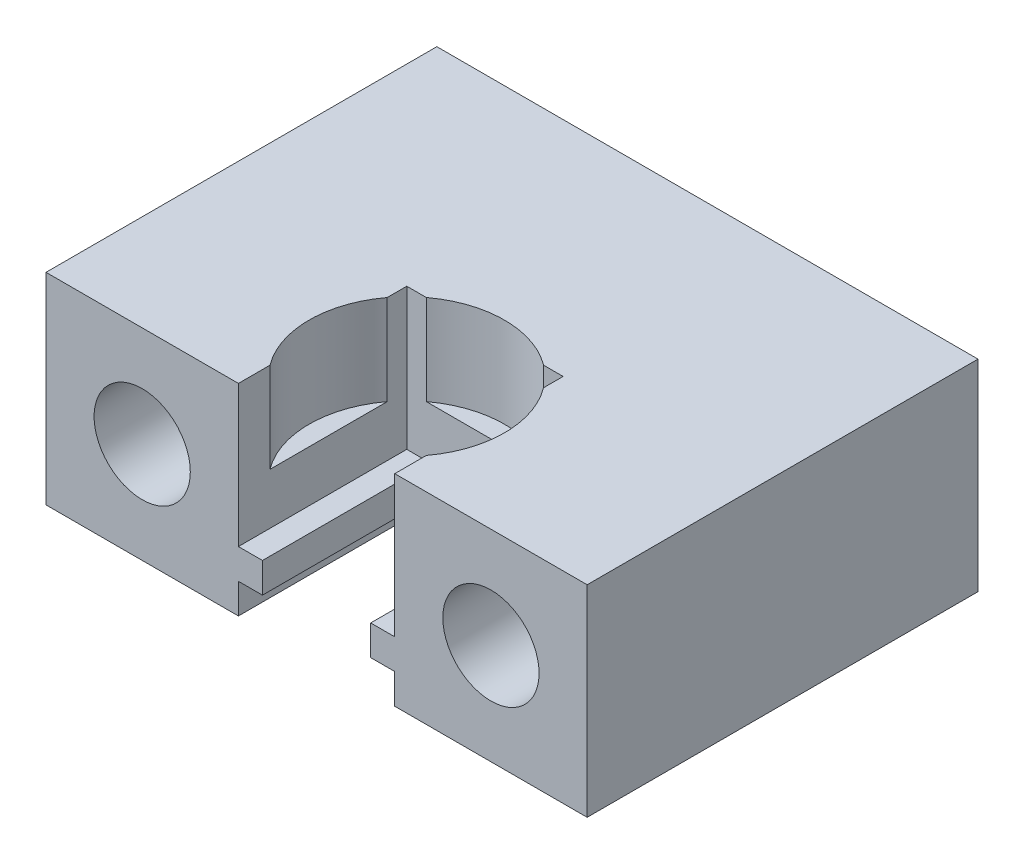
ISO-10303-21;
HEADER;
FILE_DESCRIPTION(('STEP AP214'),'2;1');
FILE_NAME('part.step','',(''),(''),'','','');
FILE_SCHEMA(('AUTOMOTIVE_DESIGN { 1 0 10303 214 1 1 1 1 }'));
ENDSEC;
DATA;
#1=APPLICATION_CONTEXT('core data for automotive mechanical design processes');
#2=APPLICATION_PROTOCOL_DEFINITION('international standard','automotive_design',2000,#1);
#3=PRODUCT_CONTEXT('',#1,'mechanical');
#4=PRODUCT('Part','Part','',(#3));
#5=PRODUCT_RELATED_PRODUCT_CATEGORY('part','',(#4));
#6=PRODUCT_DEFINITION_FORMATION('','',#4);
#7=PRODUCT_DEFINITION_CONTEXT('part definition',#1,'design');
#8=PRODUCT_DEFINITION('design','',#6,#7);
#9=PRODUCT_DEFINITION_SHAPE('','',#8);
#10=(LENGTH_UNIT() NAMED_UNIT(*) SI_UNIT(.MILLI.,.METRE.));
#11=(NAMED_UNIT(*) PLANE_ANGLE_UNIT() SI_UNIT($,.RADIAN.));
#12=(NAMED_UNIT(*) SI_UNIT($,.STERADIAN.) SOLID_ANGLE_UNIT());
#13=UNCERTAINTY_MEASURE_WITH_UNIT(LENGTH_MEASURE(1.E-05),#10,'distance_accuracy_value','');
#14=(GEOMETRIC_REPRESENTATION_CONTEXT(3) GLOBAL_UNCERTAINTY_ASSIGNED_CONTEXT((#13)) GLOBAL_UNIT_ASSIGNED_CONTEXT((#10,
#11,#12)) REPRESENTATION_CONTEXT('',''));
#15=CARTESIAN_POINT('',(0.,0.,0.));
#16=DIRECTION('',(0.,0.,1.));
#17=DIRECTION('',(1.,0.,0.));
#18=AXIS2_PLACEMENT_3D('',#15,#16,#17);
#19=CARTESIAN_POINT('',(2.6,6.7010000000001,7.39999999999997));
#20=DIRECTION('',(1.,0.,0.));
#21=DIRECTION('',(0.,0.,-1.));
#22=AXIS2_PLACEMENT_3D('',#19,#20,#21);
#23=PLANE('',#22);
#24=DIRECTION('',(0.,-1.,0.));
#25=VECTOR('',#24,1.);
#26=CARTESIAN_POINT('',(2.6,6.7010000000001,7.39999999999997));
#27=LINE('',#26,#25);
#28=CARTESIAN_POINT('',(2.6,6.70000000000005,7.39999999999997));
#29=VERTEX_POINT('',#28);
#30=CARTESIAN_POINT('',(2.6,2.,7.39999999999997));
#31=VERTEX_POINT('',#30);
#32=EDGE_CURVE('E281',#29,#31,#27,.T.);
#33=ORIENTED_EDGE('',*,*,#32,.T.);
#34=DIRECTION('',(0.,0.,1.));
#35=VECTOR('',#34,1.);
#36=CARTESIAN_POINT('',(2.6,2.,6.1193751525134));
#37=LINE('',#36,#35);
#38=CARTESIAN_POINT('',(2.6,2.,13.));
#39=VERTEX_POINT('',#38);
#40=EDGE_CURVE('E192',#31,#39,#37,.T.);
#41=ORIENTED_EDGE('',*,*,#40,.T.);
#42=DIRECTION('',(0.,-1.,0.));
#43=VECTOR('',#42,1.);
#44=CARTESIAN_POINT('',(2.6,6.7010000000001,13.));
#45=LINE('',#44,#43);
#46=CARTESIAN_POINT('',(2.6,6.70000000000003,13.));
#47=VERTEX_POINT('',#46);
#48=EDGE_CURVE('E293',#47,#39,#45,.T.);
#49=ORIENTED_EDGE('',*,*,#48,.F.);
#50=DIRECTION('',(0.,0.,-1.));
#51=VECTOR('',#50,1.);
#52=CARTESIAN_POINT('',(2.6,6.70000000000003,7.39999999999997));
#53=LINE('',#52,#51);
#54=CARTESIAN_POINT('',(2.6,6.70000000000005,11.95));
#55=VERTEX_POINT('',#54);
#56=EDGE_CURVE('E268',#47,#55,#53,.T.);
#57=ORIENTED_EDGE('',*,*,#56,.T.);
#58=DIRECTION('',(0.,1.,0.));
#59=VECTOR('',#58,1.);
#60=CARTESIAN_POINT('',(2.6,3.70000000000005,11.95));
#61=LINE('',#60,#59);
#62=CARTESIAN_POINT('',(2.6,3.70000000000005,11.95));
#63=VERTEX_POINT('',#62);
#64=EDGE_CURVE('E253',#55,#63,#61,.F.);
#65=ORIENTED_EDGE('',*,*,#64,.T.);
#66=DIRECTION('',(0.,0.,1.));
#67=VECTOR('',#66,1.);
#68=CARTESIAN_POINT('',(2.6,3.70000000000005,7.39999999999997));
#69=LINE('',#68,#67);
#70=CARTESIAN_POINT('',(2.6,3.70000000000005,8.04999999999991));
#71=VERTEX_POINT('',#70);
#72=EDGE_CURVE('E245',#71,#63,#69,.T.);
#73=ORIENTED_EDGE('',*,*,#72,.F.);
#74=DIRECTION('',(0.,1.,0.));
#75=VECTOR('',#74,1.);
#76=CARTESIAN_POINT('',(2.6,3.70000000000005,8.04999999999991));
#77=LINE('',#76,#75);
#78=CARTESIAN_POINT('',(2.6,6.70000000000005,8.04999999999991));
#79=VERTEX_POINT('',#78);
#80=EDGE_CURVE('E256',#71,#79,#77,.T.);
#81=ORIENTED_EDGE('',*,*,#80,.T.);
#82=EDGE_CURVE('E267',#79,#29,#53,.T.);
#83=ORIENTED_EDGE('',*,*,#82,.T.);
#84=EDGE_LOOP('',(#33,#41,#49,#57,#65,#73,#81,#83));
#85=FACE_BOUND('',#84,.T.);
#86=ADVANCED_FACE('F33',(#85),#23,.F.);
#87=CARTESIAN_POINT('',(-2.6,6.7010000000001,7.39999999999997));
#88=DIRECTION('',(-1.,0.,0.));
#89=DIRECTION('',(0.,0.,1.));
#90=AXIS2_PLACEMENT_3D('',#87,#88,#89);
#91=PLANE('',#90);
#92=DIRECTION('',(0.,-1.,0.));
#93=VECTOR('',#92,1.);
#94=CARTESIAN_POINT('',(-2.6,6.7010000000001,7.39999999999997));
#95=LINE('',#94,#93);
#96=CARTESIAN_POINT('',(-2.6,1.,7.39999999999997));
#97=VERTEX_POINT('',#96);
#98=CARTESIAN_POINT('',(-2.6,0.,7.39999999999997));
#99=VERTEX_POINT('',#98);
#100=EDGE_CURVE('E288',#97,#99,#95,.T.);
#101=ORIENTED_EDGE('',*,*,#100,.F.);
#102=DIRECTION('',(0.,0.,1.));
#103=VECTOR('',#102,1.);
#104=CARTESIAN_POINT('',(-2.6,1.,6.1193751525134));
#105=LINE('',#104,#103);
#106=CARTESIAN_POINT('',(-2.6,1.,13.));
#107=VERTEX_POINT('',#106);
#108=EDGE_CURVE('E230',#97,#107,#105,.T.);
#109=ORIENTED_EDGE('',*,*,#108,.T.);
#110=DIRECTION('',(0.,-1.,0.));
#111=VECTOR('',#110,1.);
#112=CARTESIAN_POINT('',(-2.6,6.7010000000001,13.));
#113=LINE('',#112,#111);
#114=CARTESIAN_POINT('',(-2.6,0.,13.));
#115=VERTEX_POINT('',#114);
#116=EDGE_CURVE('E292',#107,#115,#113,.T.);
#117=ORIENTED_EDGE('',*,*,#116,.T.);
#118=DIRECTION('',(0.,0.,-1.));
#119=VECTOR('',#118,1.);
#120=CARTESIAN_POINT('',(-2.6,0.,7.39999999999997));
#121=LINE('',#120,#119);
#122=EDGE_CURVE('E271',#115,#99,#121,.T.);
#123=ORIENTED_EDGE('',*,*,#122,.T.);
#124=EDGE_LOOP('',(#101,#109,#117,#123));
#125=FACE_BOUND('',#124,.T.);
#126=ADVANCED_FACE('F376',(#125),#91,.F.);
#127=CARTESIAN_POINT('',(0.,0.,13.));
#128=DIRECTION('',(0.,0.,1.));
#129=DIRECTION('',(1.,0.,0.));
#130=AXIS2_PLACEMENT_3D('',#127,#128,#129);
#131=PLANE('',#130);
#132=CARTESIAN_POINT('',(5.8,3.35,13.));
#133=DIRECTION('',(0.,0.,-1.));
#134=DIRECTION('',(-1.,0.,0.));
#135=AXIS2_PLACEMENT_3D('',#132,#133,#134);
#136=CIRCLE('',#135,1.6);
#137=CARTESIAN_POINT('',(4.2,3.35,13.));
#138=VERTEX_POINT('',#137);
#139=EDGE_CURVE('E432',#138,#138,#136,.T.);
#140=ORIENTED_EDGE('',*,*,#139,.T.);
#141=EDGE_LOOP('',(#140));
#142=FACE_BOUND('',#141,.T.);
#143=ORIENTED_EDGE('',*,*,#48,.T.);
#144=DIRECTION('',(-1.,0.,0.));
#145=VECTOR('',#144,1.);
#146=CARTESIAN_POINT('',(2.6,2.,13.));
#147=LINE('',#146,#145);
#148=CARTESIAN_POINT('',(1.8,2.,13.));
#149=VERTEX_POINT('',#148);
#150=EDGE_CURVE('E421',#39,#149,#147,.T.);
#151=ORIENTED_EDGE('',*,*,#150,.T.);
#152=DIRECTION('',(0.,-1.,0.));
#153=VECTOR('',#152,1.);
#154=CARTESIAN_POINT('',(1.8,1.,13.));
#155=LINE('',#154,#153);
#156=CARTESIAN_POINT('',(1.8,1.,13.));
#157=VERTEX_POINT('',#156);
#158=EDGE_CURVE('E184',#149,#157,#155,.T.);
#159=ORIENTED_EDGE('',*,*,#158,.T.);
#160=DIRECTION('',(1.,0.,0.));
#161=VECTOR('',#160,1.);
#162=CARTESIAN_POINT('',(2.6,1.,13.));
#163=LINE('',#162,#161);
#164=CARTESIAN_POINT('',(2.6,1.,13.));
#165=VERTEX_POINT('',#164);
#166=EDGE_CURVE('E196',#157,#165,#163,.T.);
#167=ORIENTED_EDGE('',*,*,#166,.T.);
#168=CARTESIAN_POINT('',(2.6,0.,13.));
#169=VERTEX_POINT('',#168);
#170=EDGE_CURVE('E280',#165,#169,#45,.T.);
#171=ORIENTED_EDGE('',*,*,#170,.T.);
#172=DIRECTION('',(1.,0.,0.));
#173=VECTOR('',#172,1.);
#174=CARTESIAN_POINT('',(-8.99999999999999,0.,13.));
#175=LINE('',#174,#173);
#176=CARTESIAN_POINT('',(8.99999999999999,0.,13.));
#177=VERTEX_POINT('',#176);
#178=EDGE_CURVE('E299',#169,#177,#175,.T.);
#179=ORIENTED_EDGE('',*,*,#178,.T.);
#180=DIRECTION('',(0.,1.,0.));
#181=VECTOR('',#180,1.);
#182=CARTESIAN_POINT('',(8.99999999999999,6.69999999999999,13.));
#183=LINE('',#182,#181);
#184=CARTESIAN_POINT('',(8.99999999999999,6.69999999999999,13.));
#185=VERTEX_POINT('',#184);
#186=EDGE_CURVE('E304',#177,#185,#183,.T.);
#187=ORIENTED_EDGE('',*,*,#186,.T.);
#188=DIRECTION('',(-1.,0.,0.));
#189=VECTOR('',#188,1.);
#190=CARTESIAN_POINT('',(-8.99999999999999,6.7000000000001,13.));
#191=LINE('',#190,#189);
#192=EDGE_CURVE('E307',#185,#47,#191,.T.);
#193=ORIENTED_EDGE('',*,*,#192,.T.);
#194=EDGE_LOOP('',(#143,#151,#159,#167,#171,#179,#187,#193));
#195=FACE_BOUND('',#194,.T.);
#196=ADVANCED_FACE('F400',(#142,#195),#131,.T.);
#197=CARTESIAN_POINT('',(-8.99999999999999,6.7000000000001,13.));
#198=DIRECTION('',(1.,0.,0.));
#199=DIRECTION('',(0.,0.,-1.));
#200=AXIS2_PLACEMENT_3D('',#197,#198,#199);
#201=PLANE('',#200);
#202=DIRECTION('',(0.,-1.,0.));
#203=VECTOR('',#202,1.);
#204=CARTESIAN_POINT('',(-8.99999999999999,6.7000000000001,0.));
#205=LINE('',#204,#203);
#206=CARTESIAN_POINT('',(-8.99999999999999,6.7000000000001,0.));
#207=VERTEX_POINT('',#206);
#208=CARTESIAN_POINT('',(-8.99999999999999,0.,0.));
#209=VERTEX_POINT('',#208);
#210=EDGE_CURVE('E283',#207,#209,#205,.T.);
#211=ORIENTED_EDGE('',*,*,#210,.T.);
#212=DIRECTION('',(0.,0.,-1.));
#213=VECTOR('',#212,1.);
#214=CARTESIAN_POINT('',(-8.99999999999999,0.,13.));
#215=LINE('',#214,#213);
#216=CARTESIAN_POINT('',(-8.99999999999999,0.,13.));
#217=VERTEX_POINT('',#216);
#218=EDGE_CURVE('E326',#217,#209,#215,.T.);
#219=ORIENTED_EDGE('',*,*,#218,.F.);
#220=DIRECTION('',(0.,-1.,0.));
#221=VECTOR('',#220,1.);
#222=CARTESIAN_POINT('',(-8.99999999999999,6.7000000000001,13.));
#223=LINE('',#222,#221);
#224=CARTESIAN_POINT('',(-8.99999999999999,6.7000000000001,13.));
#225=VERTEX_POINT('',#224);
#226=EDGE_CURVE('E296',#225,#217,#223,.T.);
#227=ORIENTED_EDGE('',*,*,#226,.F.);
#228=DIRECTION('',(0.,0.,-1.));
#229=VECTOR('',#228,1.);
#230=CARTESIAN_POINT('',(-8.99999999999999,6.7000000000001,13.));
#231=LINE('',#230,#229);
#232=EDGE_CURVE('E310',#225,#207,#231,.T.);
#233=ORIENTED_EDGE('',*,*,#232,.T.);
#234=EDGE_LOOP('',(#211,#219,#227,#233));
#235=FACE_BOUND('',#234,.T.);
#236=ADVANCED_FACE('F35',(#235),#201,.F.);
#237=CARTESIAN_POINT('',(-8.99999999999999,0.,13.));
#238=DIRECTION('',(0.,1.,0.));
#239=DIRECTION('',(0.,0.,1.));
#240=AXIS2_PLACEMENT_3D('',#237,#238,#239);
#241=PLANE('',#240);
#242=ORIENTED_EDGE('',*,*,#178,.F.);
#243=DIRECTION('',(0.,0.,1.));
#244=VECTOR('',#243,1.);
#245=CARTESIAN_POINT('',(2.6,0.,7.39999999999997));
#246=LINE('',#245,#244);
#247=CARTESIAN_POINT('',(2.6,0.,7.39999999999997));
#248=VERTEX_POINT('',#247);
#249=EDGE_CURVE('E277',#248,#169,#246,.T.);
#250=ORIENTED_EDGE('',*,*,#249,.F.);
#251=DIRECTION('',(1.,0.,0.));
#252=VECTOR('',#251,1.);
#253=CARTESIAN_POINT('',(-2.6,0.,7.39999999999997));
#254=LINE('',#253,#252);
#255=EDGE_CURVE('E274',#99,#248,#254,.T.);
#256=ORIENTED_EDGE('',*,*,#255,.F.);
#257=ORIENTED_EDGE('',*,*,#122,.F.);
#258=EDGE_CURVE('E301',#217,#115,#175,.T.);
#259=ORIENTED_EDGE('',*,*,#258,.F.);
#260=ORIENTED_EDGE('',*,*,#218,.T.);
#261=DIRECTION('',(1.,0.,0.));
#262=VECTOR('',#261,1.);
#263=CARTESIAN_POINT('',(-8.99999999999999,0.,0.));
#264=LINE('',#263,#262);
#265=CARTESIAN_POINT('',(8.99999999999999,0.,0.));
#266=VERTEX_POINT('',#265);
#267=EDGE_CURVE('E313',#209,#266,#264,.T.);
#268=ORIENTED_EDGE('',*,*,#267,.T.);
#269=DIRECTION('',(0.,0.,-1.));
#270=VECTOR('',#269,1.);
#271=CARTESIAN_POINT('',(8.99999999999999,0.,13.));
#272=LINE('',#271,#270);
#273=EDGE_CURVE('E323',#177,#266,#272,.T.);
#274=ORIENTED_EDGE('',*,*,#273,.F.);
#275=EDGE_LOOP('',(#242,#250,#256,#257,#259,#260,#268,#274));
#276=FACE_BOUND('',#275,.T.);
#277=ADVANCED_FACE('F371',(#276),#241,.F.);
#278=CARTESIAN_POINT('',(8.99999999999999,6.69999999999999,13.));
#279=DIRECTION('',(-1.,0.,0.));
#280=DIRECTION('',(0.,-1.,0.));
#281=AXIS2_PLACEMENT_3D('',#278,#279,#280);
#282=PLANE('',#281);
#283=DIRECTION('',(0.,1.,0.));
#284=VECTOR('',#283,1.);
#285=CARTESIAN_POINT('',(8.99999999999999,6.69999999999999,0.));
#286=LINE('',#285,#284);
#287=CARTESIAN_POINT('',(8.99999999999999,6.69999999999999,0.));
#288=VERTEX_POINT('',#287);
#289=EDGE_CURVE('E315',#266,#288,#286,.T.);
#290=ORIENTED_EDGE('',*,*,#289,.T.);
#291=DIRECTION('',(0.,0.,-1.));
#292=VECTOR('',#291,1.);
#293=CARTESIAN_POINT('',(8.99999999999999,6.69999999999999,13.));
#294=LINE('',#293,#292);
#295=EDGE_CURVE('E320',#185,#288,#294,.T.);
#296=ORIENTED_EDGE('',*,*,#295,.F.);
#297=ORIENTED_EDGE('',*,*,#186,.F.);
#298=ORIENTED_EDGE('',*,*,#273,.T.);
#299=EDGE_LOOP('',(#290,#296,#297,#298));
#300=FACE_BOUND('',#299,.T.);
#301=ADVANCED_FACE('F507',(#300),#282,.F.);
#302=CARTESIAN_POINT('',(-8.99999999999999,6.7000000000001,13.));
#303=DIRECTION('',(0.,-1.,0.));
#304=DIRECTION('',(1.,0.,0.));
#305=AXIS2_PLACEMENT_3D('',#302,#303,#304);
#306=PLANE('',#305);
#307=DIRECTION('',(0.,0.,1.));
#308=VECTOR('',#307,1.);
#309=CARTESIAN_POINT('',(-2.6,6.70000000000006,7.39999999999997));
#310=LINE('',#309,#308);
#311=CARTESIAN_POINT('',(-2.6,6.70000000000005,11.9499999999999));
#312=VERTEX_POINT('',#311);
#313=CARTESIAN_POINT('',(-2.6,6.70000000000006,13.));
#314=VERTEX_POINT('',#313);
#315=EDGE_CURVE('E259',#312,#314,#310,.T.);
#316=ORIENTED_EDGE('',*,*,#315,.F.);
#317=CARTESIAN_POINT('',(0.,6.70000000000005,9.99999999999997));
#318=DIRECTION('',(0.,1.,0.));
#319=DIRECTION('',(0.,0.,1.));
#320=AXIS2_PLACEMENT_3D('',#317,#318,#319);
#321=CIRCLE('',#320,3.25);
#322=CARTESIAN_POINT('',(-2.6,6.70000000000005,8.05000000000002));
#323=VERTEX_POINT('',#322);
#324=EDGE_CURVE('E235',#323,#312,#321,.T.);
#325=ORIENTED_EDGE('',*,*,#324,.F.);
#326=CARTESIAN_POINT('',(-2.6,6.70000000000006,7.39999999999997));
#327=VERTEX_POINT('',#326);
#328=EDGE_CURVE('E260',#327,#323,#310,.T.);
#329=ORIENTED_EDGE('',*,*,#328,.F.);
#330=DIRECTION('',(-1.,0.,0.));
#331=VECTOR('',#330,1.);
#332=CARTESIAN_POINT('',(-2.6,6.70000000000006,7.39999999999997));
#333=LINE('',#332,#331);
#334=CARTESIAN_POINT('',(-1.94999999999996,6.70000000000005,7.39999999999997));
#335=VERTEX_POINT('',#334);
#336=EDGE_CURVE('E263',#335,#327,#333,.T.);
#337=ORIENTED_EDGE('',*,*,#336,.F.);
#338=CARTESIAN_POINT('',(1.95000000000004,6.70000000000005,7.39999999999997));
#339=VERTEX_POINT('',#338);
#340=EDGE_CURVE('E243',#339,#335,#321,.T.);
#341=ORIENTED_EDGE('',*,*,#340,.F.);
#342=EDGE_CURVE('E264',#29,#339,#333,.T.);
#343=ORIENTED_EDGE('',*,*,#342,.F.);
#344=ORIENTED_EDGE('',*,*,#82,.F.);
#345=EDGE_CURVE('E241',#55,#79,#321,.T.);
#346=ORIENTED_EDGE('',*,*,#345,.F.);
#347=ORIENTED_EDGE('',*,*,#56,.F.);
#348=ORIENTED_EDGE('',*,*,#192,.F.);
#349=ORIENTED_EDGE('',*,*,#295,.T.);
#350=DIRECTION('',(-1.,0.,0.));
#351=VECTOR('',#350,1.);
#352=CARTESIAN_POINT('',(-8.99999999999999,6.7000000000001,0.));
#353=LINE('',#352,#351);
#354=EDGE_CURVE('E300',#288,#207,#353,.T.);
#355=ORIENTED_EDGE('',*,*,#354,.T.);
#356=ORIENTED_EDGE('',*,*,#232,.F.);
#357=EDGE_CURVE('E306',#314,#225,#191,.T.);
#358=ORIENTED_EDGE('',*,*,#357,.F.);
#359=EDGE_LOOP('',(#316,#325,#329,#337,#341,#343,#344,#346,#347,#348,#349,#355,#356,#358));
#360=FACE_BOUND('',#359,.T.);
#361=ADVANCED_FACE('F343',(#360),#306,.F.);
#362=CARTESIAN_POINT('',(-5.8,3.35,13.));
#363=DIRECTION('',(0.,0.,1.));
#364=DIRECTION('',(1.,0.,0.));
#365=AXIS2_PLACEMENT_3D('',#362,#363,#364);
#366=CIRCLE('',#365,1.6);
#367=CARTESIAN_POINT('',(-4.2,3.35,13.));
#368=VERTEX_POINT('',#367);
#369=EDGE_CURVE('E428',#368,#368,#366,.T.);
#370=ORIENTED_EDGE('',*,*,#369,.F.);
#371=EDGE_LOOP('',(#370));
#372=FACE_BOUND('',#371,.T.);
#373=CARTESIAN_POINT('',(-2.6,2.,13.));
#374=VERTEX_POINT('',#373);
#375=EDGE_CURVE('E289',#314,#374,#113,.T.);
#376=ORIENTED_EDGE('',*,*,#375,.F.);
#377=ORIENTED_EDGE('',*,*,#357,.T.);
#378=ORIENTED_EDGE('',*,*,#226,.T.);
#379=ORIENTED_EDGE('',*,*,#258,.T.);
#380=ORIENTED_EDGE('',*,*,#116,.F.);
#381=DIRECTION('',(1.,0.,0.));
#382=VECTOR('',#381,1.);
#383=CARTESIAN_POINT('',(-2.6,1.,13.));
#384=LINE('',#383,#382);
#385=CARTESIAN_POINT('',(-1.8,1.,13.));
#386=VERTEX_POINT('',#385);
#387=EDGE_CURVE('E210',#107,#386,#384,.T.);
#388=ORIENTED_EDGE('',*,*,#387,.T.);
#389=DIRECTION('',(0.,1.,0.));
#390=VECTOR('',#389,1.);
#391=CARTESIAN_POINT('',(-1.8,1.,13.));
#392=LINE('',#391,#390);
#393=CARTESIAN_POINT('',(-1.8,2.,13.));
#394=VERTEX_POINT('',#393);
#395=EDGE_CURVE('E215',#386,#394,#392,.T.);
#396=ORIENTED_EDGE('',*,*,#395,.T.);
#397=DIRECTION('',(-1.,0.,0.));
#398=VECTOR('',#397,1.);
#399=CARTESIAN_POINT('',(-2.6,2.,13.));
#400=LINE('',#399,#398);
#401=EDGE_CURVE('E211',#394,#374,#400,.T.);
#402=ORIENTED_EDGE('',*,*,#401,.T.);
#403=EDGE_LOOP('',(#376,#377,#378,#379,#380,#388,#396,#402));
#404=FACE_BOUND('',#403,.T.);
#405=ADVANCED_FACE('F359',(#372,#404),#131,.T.);
#406=CARTESIAN_POINT('',(0.,0.,0.));
#407=DIRECTION('',(0.,0.,1.));
#408=DIRECTION('',(1.,0.,0.));
#409=AXIS2_PLACEMENT_3D('',#406,#407,#408);
#410=PLANE('',#409);
#411=CARTESIAN_POINT('',(5.8,3.35,0.));
#412=DIRECTION('',(0.,0.,1.));
#413=DIRECTION('',(1.,0.,0.));
#414=AXIS2_PLACEMENT_3D('',#411,#412,#413);
#415=CIRCLE('',#414,1.6);
#416=CARTESIAN_POINT('',(7.4,3.35,0.));
#417=VERTEX_POINT('',#416);
#418=EDGE_CURVE('E436',#417,#417,#415,.T.);
#419=ORIENTED_EDGE('',*,*,#418,.T.);
#420=EDGE_LOOP('',(#419));
#421=FACE_BOUND('',#420,.T.);
#422=CARTESIAN_POINT('',(-5.8,3.35,0.));
#423=DIRECTION('',(0.,0.,1.));
#424=DIRECTION('',(1.,0.,0.));
#425=AXIS2_PLACEMENT_3D('',#422,#423,#424);
#426=CIRCLE('',#425,1.6);
#427=CARTESIAN_POINT('',(-4.2,3.35,0.));
#428=VERTEX_POINT('',#427);
#429=EDGE_CURVE('E424',#428,#428,#426,.F.);
#430=ORIENTED_EDGE('',*,*,#429,.F.);
#431=EDGE_LOOP('',(#430));
#432=FACE_BOUND('',#431,.T.);
#433=ORIENTED_EDGE('',*,*,#210,.F.);
#434=ORIENTED_EDGE('',*,*,#354,.F.);
#435=ORIENTED_EDGE('',*,*,#289,.F.);
#436=ORIENTED_EDGE('',*,*,#267,.F.);
#437=EDGE_LOOP('',(#433,#434,#435,#436));
#438=FACE_BOUND('',#437,.T.);
#439=ADVANCED_FACE('F405',(#421,#432,#438),#410,.F.);
#440=ORIENTED_EDGE('',*,*,#170,.F.);
#441=DIRECTION('',(0.,0.,1.));
#442=VECTOR('',#441,1.);
#443=CARTESIAN_POINT('',(2.6,1.,6.1193751525134));
#444=LINE('',#443,#442);
#445=CARTESIAN_POINT('',(2.6,1.,7.39999999999997));
#446=VERTEX_POINT('',#445);
#447=EDGE_CURVE('E207',#446,#165,#444,.T.);
#448=ORIENTED_EDGE('',*,*,#447,.F.);
#449=EDGE_CURVE('E284',#446,#248,#27,.T.);
#450=ORIENTED_EDGE('',*,*,#449,.T.);
#451=ORIENTED_EDGE('',*,*,#249,.T.);
#452=EDGE_LOOP('',(#440,#448,#450,#451));
#453=FACE_BOUND('',#452,.T.);
#454=ADVANCED_FACE('F396',(#453),#23,.F.);
#455=CARTESIAN_POINT('',(-2.6,6.7010000000001,7.39999999999997));
#456=DIRECTION('',(0.,0.,-1.));
#457=DIRECTION('',(-1.,0.,0.));
#458=AXIS2_PLACEMENT_3D('',#455,#456,#457);
#459=PLANE('',#458);
#460=DIRECTION('',(0.,-1.,0.));
#461=VECTOR('',#460,1.);
#462=CARTESIAN_POINT('',(1.8,1.,7.39999999999997));
#463=LINE('',#462,#461);
#464=CARTESIAN_POINT('',(1.8,2.,7.39999999999997));
#465=VERTEX_POINT('',#464);
#466=CARTESIAN_POINT('',(1.8,1.,7.39999999999997));
#467=VERTEX_POINT('',#466);
#468=EDGE_CURVE('E48',#465,#467,#463,.T.);
#469=ORIENTED_EDGE('',*,*,#468,.F.);
#470=DIRECTION('',(-1.,0.,0.));
#471=VECTOR('',#470,1.);
#472=CARTESIAN_POINT('',(2.6,2.,7.39999999999997));
#473=LINE('',#472,#471);
#474=EDGE_CURVE('E187',#31,#465,#473,.T.);
#475=ORIENTED_EDGE('',*,*,#474,.F.);
#476=ORIENTED_EDGE('',*,*,#32,.F.);
#477=ORIENTED_EDGE('',*,*,#342,.T.);
#478=DIRECTION('',(0.,1.,0.));
#479=VECTOR('',#478,1.);
#480=CARTESIAN_POINT('',(1.95000000000005,3.70000000000005,7.39999999999997));
#481=LINE('',#480,#479);
#482=CARTESIAN_POINT('',(1.95000000000004,3.70000000000005,7.39999999999997));
#483=VERTEX_POINT('',#482);
#484=EDGE_CURVE('E247',#339,#483,#481,.F.);
#485=ORIENTED_EDGE('',*,*,#484,.T.);
#486=DIRECTION('',(1.,0.,0.));
#487=VECTOR('',#486,1.);
#488=CARTESIAN_POINT('',(-2.6,3.70000000000005,7.39999999999997));
#489=LINE('',#488,#487);
#490=CARTESIAN_POINT('',(-1.94999999999996,3.70000000000005,7.39999999999997));
#491=VERTEX_POINT('',#490);
#492=EDGE_CURVE('E238',#491,#483,#489,.T.);
#493=ORIENTED_EDGE('',*,*,#492,.F.);
#494=DIRECTION('',(0.,1.,0.));
#495=VECTOR('',#494,1.);
#496=CARTESIAN_POINT('',(-1.94999999999996,3.70000000000005,7.39999999999997));
#497=LINE('',#496,#495);
#498=EDGE_CURVE('E250',#491,#335,#497,.T.);
#499=ORIENTED_EDGE('',*,*,#498,.T.);
#500=ORIENTED_EDGE('',*,*,#336,.T.);
#501=CARTESIAN_POINT('',(-2.6,2.,7.39999999999997));
#502=VERTEX_POINT('',#501);
#503=EDGE_CURVE('E285',#327,#502,#95,.T.);
#504=ORIENTED_EDGE('',*,*,#503,.T.);
#505=DIRECTION('',(-1.,0.,0.));
#506=VECTOR('',#505,1.);
#507=CARTESIAN_POINT('',(-2.6,2.,7.39999999999997));
#508=LINE('',#507,#506);
#509=CARTESIAN_POINT('',(-1.8,2.,7.39999999999997));
#510=VERTEX_POINT('',#509);
#511=EDGE_CURVE('E56',#510,#502,#508,.T.);
#512=ORIENTED_EDGE('',*,*,#511,.F.);
#513=DIRECTION('',(0.,1.,0.));
#514=VECTOR('',#513,1.);
#515=CARTESIAN_POINT('',(-1.8,1.,7.39999999999997));
#516=LINE('',#515,#514);
#517=CARTESIAN_POINT('',(-1.8,1.,7.39999999999997));
#518=VERTEX_POINT('',#517);
#519=EDGE_CURVE('E226',#518,#510,#516,.T.);
#520=ORIENTED_EDGE('',*,*,#519,.F.);
#521=DIRECTION('',(1.,0.,0.));
#522=VECTOR('',#521,1.);
#523=CARTESIAN_POINT('',(-2.6,1.,7.39999999999997));
#524=LINE('',#523,#522);
#525=EDGE_CURVE('E214',#97,#518,#524,.T.);
#526=ORIENTED_EDGE('',*,*,#525,.F.);
#527=ORIENTED_EDGE('',*,*,#100,.T.);
#528=ORIENTED_EDGE('',*,*,#255,.T.);
#529=ORIENTED_EDGE('',*,*,#449,.F.);
#530=DIRECTION('',(1.,0.,0.));
#531=VECTOR('',#530,1.);
#532=CARTESIAN_POINT('',(2.6,1.,7.39999999999997));
#533=LINE('',#532,#531);
#534=EDGE_CURVE('E201',#467,#446,#533,.T.);
#535=ORIENTED_EDGE('',*,*,#534,.F.);
#536=EDGE_LOOP('',(#469,#475,#476,#477,#485,#493,#499,#500,#504,#512,#520,#526,#527,#528,#529,#535));
#537=FACE_BOUND('',#536,.T.);
#538=ADVANCED_FACE('F199',(#537),#459,.F.);
#539=ORIENTED_EDGE('',*,*,#375,.T.);
#540=DIRECTION('',(0.,0.,1.));
#541=VECTOR('',#540,1.);
#542=CARTESIAN_POINT('',(-2.6,2.,6.1193751525134));
#543=LINE('',#542,#541);
#544=EDGE_CURVE('E224',#502,#374,#543,.T.);
#545=ORIENTED_EDGE('',*,*,#544,.F.);
#546=ORIENTED_EDGE('',*,*,#503,.F.);
#547=ORIENTED_EDGE('',*,*,#328,.T.);
#548=DIRECTION('',(0.,1.,0.));
#549=VECTOR('',#548,1.);
#550=CARTESIAN_POINT('',(-2.6,3.70000000000005,8.05000000000002));
#551=LINE('',#550,#549);
#552=CARTESIAN_POINT('',(-2.6,3.70000000000005,8.05000000000002));
#553=VERTEX_POINT('',#552);
#554=EDGE_CURVE('E41',#323,#553,#551,.F.);
#555=ORIENTED_EDGE('',*,*,#554,.T.);
#556=DIRECTION('',(0.,0.,-1.));
#557=VECTOR('',#556,1.);
#558=CARTESIAN_POINT('',(-2.6,3.70000000000005,7.39999999999997));
#559=LINE('',#558,#557);
#560=CARTESIAN_POINT('',(-2.6,3.70000000000005,11.9499999999999));
#561=VERTEX_POINT('',#560);
#562=EDGE_CURVE('E329',#561,#553,#559,.T.);
#563=ORIENTED_EDGE('',*,*,#562,.F.);
#564=DIRECTION('',(0.,1.,0.));
#565=VECTOR('',#564,1.);
#566=CARTESIAN_POINT('',(-2.6,3.70000000000005,11.9499999999999));
#567=LINE('',#566,#565);
#568=EDGE_CURVE('E11',#561,#312,#567,.T.);
#569=ORIENTED_EDGE('',*,*,#568,.T.);
#570=ORIENTED_EDGE('',*,*,#315,.T.);
#571=EDGE_LOOP('',(#539,#545,#546,#547,#555,#563,#569,#570));
#572=FACE_BOUND('',#571,.T.);
#573=ADVANCED_FACE('F333',(#572),#91,.F.);
#574=CARTESIAN_POINT('',(0.,3.70000000000005,9.99999999999997));
#575=DIRECTION('',(0.,1.,0.));
#576=DIRECTION('',(0.,0.,1.));
#577=AXIS2_PLACEMENT_3D('',#574,#575,#576);
#578=PLANE('',#577);
#579=ORIENTED_EDGE('',*,*,#562,.T.);
#580=CARTESIAN_POINT('',(0.,3.70000000000005,9.99999999999997));
#581=DIRECTION('',(0.,1.,0.));
#582=DIRECTION('',(0.,0.,1.));
#583=AXIS2_PLACEMENT_3D('',#580,#581,#582);
#584=CIRCLE('',#583,3.25);
#585=EDGE_CURVE('E240',#553,#561,#584,.T.);
#586=ORIENTED_EDGE('',*,*,#585,.T.);
#587=EDGE_LOOP('',(#579,#586));
#588=FACE_BOUND('',#587,.T.);
#589=ADVANCED_FACE('F356',(#588),#578,.T.);
#590=CARTESIAN_POINT('',(0.,3.70000000000005,9.99999999999997));
#591=DIRECTION('',(0.,1.,0.));
#592=DIRECTION('',(0.,0.,1.));
#593=AXIS2_PLACEMENT_3D('',#590,#591,#592);
#594=CYLINDRICAL_SURFACE('',#593,3.25);
#595=ORIENTED_EDGE('',*,*,#585,.F.);
#596=ORIENTED_EDGE('',*,*,#554,.F.);
#597=ORIENTED_EDGE('',*,*,#324,.T.);
#598=ORIENTED_EDGE('',*,*,#568,.F.);
#599=EDGE_LOOP('',(#595,#596,#597,#598));
#600=FACE_BOUND('',#599,.T.);
#601=ADVANCED_FACE('F339',(#600),#594,.F.);
#602=ORIENTED_EDGE('',*,*,#492,.T.);
#603=EDGE_CURVE('E239',#483,#491,#584,.T.);
#604=ORIENTED_EDGE('',*,*,#603,.T.);
#605=EDGE_LOOP('',(#602,#604));
#606=FACE_BOUND('',#605,.T.);
#607=ADVANCED_FACE('F354',(#606),#578,.T.);
#608=ORIENTED_EDGE('',*,*,#603,.F.);
#609=ORIENTED_EDGE('',*,*,#484,.F.);
#610=ORIENTED_EDGE('',*,*,#340,.T.);
#611=ORIENTED_EDGE('',*,*,#498,.F.);
#612=EDGE_LOOP('',(#608,#609,#610,#611));
#613=FACE_BOUND('',#612,.T.);
#614=ADVANCED_FACE('F350',(#613),#594,.F.);
#615=EDGE_CURVE('E236',#63,#71,#584,.T.);
#616=ORIENTED_EDGE('',*,*,#615,.F.);
#617=ORIENTED_EDGE('',*,*,#64,.F.);
#618=ORIENTED_EDGE('',*,*,#345,.T.);
#619=ORIENTED_EDGE('',*,*,#80,.F.);
#620=EDGE_LOOP('',(#616,#617,#618,#619));
#621=FACE_BOUND('',#620,.T.);
#622=ADVANCED_FACE('F571',(#621),#594,.F.);
#623=ORIENTED_EDGE('',*,*,#72,.T.);
#624=ORIENTED_EDGE('',*,*,#615,.T.);
#625=EDGE_LOOP('',(#623,#624));
#626=FACE_BOUND('',#625,.T.);
#627=ADVANCED_FACE('F545',(#626),#578,.T.);
#628=CARTESIAN_POINT('',(-2.6,1.,6.1193751525134));
#629=DIRECTION('',(0.,-1.,0.));
#630=DIRECTION('',(1.,0.,0.));
#631=AXIS2_PLACEMENT_3D('',#628,#629,#630);
#632=PLANE('',#631);
#633=ORIENTED_EDGE('',*,*,#108,.F.);
#634=ORIENTED_EDGE('',*,*,#525,.T.);
#635=DIRECTION('',(0.,0.,1.));
#636=VECTOR('',#635,1.);
#637=CARTESIAN_POINT('',(-1.8,1.,6.1193751525134));
#638=LINE('',#637,#636);
#639=EDGE_CURVE('E222',#518,#386,#638,.T.);
#640=ORIENTED_EDGE('',*,*,#639,.T.);
#641=ORIENTED_EDGE('',*,*,#387,.F.);
#642=EDGE_LOOP('',(#633,#634,#640,#641));
#643=FACE_BOUND('',#642,.T.);
#644=ADVANCED_FACE('F379',(#643),#632,.T.);
#645=CARTESIAN_POINT('',(-1.8,1.,6.1193751525134));
#646=DIRECTION('',(1.,0.,0.));
#647=DIRECTION('',(0.,0.,-1.));
#648=AXIS2_PLACEMENT_3D('',#645,#646,#647);
#649=PLANE('',#648);
#650=ORIENTED_EDGE('',*,*,#639,.F.);
#651=ORIENTED_EDGE('',*,*,#519,.T.);
#652=DIRECTION('',(0.,0.,1.));
#653=VECTOR('',#652,1.);
#654=CARTESIAN_POINT('',(-1.8,2.,6.1193751525134));
#655=LINE('',#654,#653);
#656=EDGE_CURVE('E225',#510,#394,#655,.T.);
#657=ORIENTED_EDGE('',*,*,#656,.T.);
#658=ORIENTED_EDGE('',*,*,#395,.F.);
#659=EDGE_LOOP('',(#650,#651,#657,#658));
#660=FACE_BOUND('',#659,.T.);
#661=ADVANCED_FACE('F382',(#660),#649,.T.);
#662=CARTESIAN_POINT('',(-2.6,2.,6.1193751525134));
#663=DIRECTION('',(0.,1.,0.));
#664=DIRECTION('',(0.,0.,1.));
#665=AXIS2_PLACEMENT_3D('',#662,#663,#664);
#666=PLANE('',#665);
#667=ORIENTED_EDGE('',*,*,#656,.F.);
#668=ORIENTED_EDGE('',*,*,#511,.T.);
#669=ORIENTED_EDGE('',*,*,#544,.T.);
#670=ORIENTED_EDGE('',*,*,#401,.F.);
#671=EDGE_LOOP('',(#667,#668,#669,#670));
#672=FACE_BOUND('',#671,.T.);
#673=ADVANCED_FACE('F384',(#672),#666,.T.);
#674=CARTESIAN_POINT('',(2.6,2.,6.1193751525134));
#675=DIRECTION('',(0.,1.,0.));
#676=DIRECTION('',(0.,0.,1.));
#677=AXIS2_PLACEMENT_3D('',#674,#675,#676);
#678=PLANE('',#677);
#679=ORIENTED_EDGE('',*,*,#40,.F.);
#680=ORIENTED_EDGE('',*,*,#474,.T.);
#681=DIRECTION('',(0.,0.,1.));
#682=VECTOR('',#681,1.);
#683=CARTESIAN_POINT('',(1.8,2.,6.1193751525134));
#684=LINE('',#683,#682);
#685=EDGE_CURVE('E180',#465,#149,#684,.T.);
#686=ORIENTED_EDGE('',*,*,#685,.T.);
#687=ORIENTED_EDGE('',*,*,#150,.F.);
#688=EDGE_LOOP('',(#679,#680,#686,#687));
#689=FACE_BOUND('',#688,.T.);
#690=ADVANCED_FACE('F190',(#689),#678,.T.);
#691=CARTESIAN_POINT('',(1.8,1.,6.1193751525134));
#692=DIRECTION('',(-1.,0.,0.));
#693=DIRECTION('',(0.,0.,1.));
#694=AXIS2_PLACEMENT_3D('',#691,#692,#693);
#695=PLANE('',#694);
#696=ORIENTED_EDGE('',*,*,#685,.F.);
#697=ORIENTED_EDGE('',*,*,#468,.T.);
#698=DIRECTION('',(0.,0.,1.));
#699=VECTOR('',#698,1.);
#700=CARTESIAN_POINT('',(1.8,1.,6.1193751525134));
#701=LINE('',#700,#699);
#702=EDGE_CURVE('E202',#467,#157,#701,.T.);
#703=ORIENTED_EDGE('',*,*,#702,.T.);
#704=ORIENTED_EDGE('',*,*,#158,.F.);
#705=EDGE_LOOP('',(#696,#697,#703,#704));
#706=FACE_BOUND('',#705,.T.);
#707=ADVANCED_FACE('F182',(#706),#695,.T.);
#708=CARTESIAN_POINT('',(2.6,1.,6.1193751525134));
#709=DIRECTION('',(0.,-1.,0.));
#710=DIRECTION('',(1.,0.,0.));
#711=AXIS2_PLACEMENT_3D('',#708,#709,#710);
#712=PLANE('',#711);
#713=ORIENTED_EDGE('',*,*,#702,.F.);
#714=ORIENTED_EDGE('',*,*,#534,.T.);
#715=ORIENTED_EDGE('',*,*,#447,.T.);
#716=ORIENTED_EDGE('',*,*,#166,.F.);
#717=EDGE_LOOP('',(#713,#714,#715,#716));
#718=FACE_BOUND('',#717,.T.);
#719=ADVANCED_FACE('F451',(#718),#712,.T.);
#720=CARTESIAN_POINT('',(-5.8,3.35,-0.000999999999999265));
#721=DIRECTION('',(0.,0.,1.));
#722=DIRECTION('',(1.,0.,0.));
#723=AXIS2_PLACEMENT_3D('',#720,#721,#722);
#724=CYLINDRICAL_SURFACE('',#723,1.6);
#725=ORIENTED_EDGE('',*,*,#369,.T.);
#726=EDGE_LOOP('',(#725));
#727=FACE_BOUND('',#726,.T.);
#728=ORIENTED_EDGE('',*,*,#429,.T.);
#729=EDGE_LOOP('',(#728));
#730=FACE_BOUND('',#729,.T.);
#731=ADVANCED_FACE('F445',(#727,#730),#724,.F.);
#732=CARTESIAN_POINT('',(5.8,3.35,-0.000999999999999265));
#733=DIRECTION('',(0.,0.,1.));
#734=DIRECTION('',(1.,0.,0.));
#735=AXIS2_PLACEMENT_3D('',#732,#733,#734);
#736=CYLINDRICAL_SURFACE('',#735,1.6);
#737=ORIENTED_EDGE('',*,*,#139,.F.);
#738=EDGE_LOOP('',(#737));
#739=FACE_BOUND('',#738,.T.);
#740=ORIENTED_EDGE('',*,*,#418,.F.);
#741=EDGE_LOOP('',(#740));
#742=FACE_BOUND('',#741,.T.);
#743=ADVANCED_FACE('F443',(#739,#742),#736,.F.);
#744=CLOSED_SHELL('',(#86,#126,#196,#236,#277,#301,#361,#405,#439,#454,#538,#573,#589,#601,#607,
#614,#622,#627,#644,#661,#673,#690,#707,#719,#731,#743));
#745=MANIFOLD_SOLID_BREP('B2',#744);
#746=ADVANCED_BREP_SHAPE_REPRESENTATION('',(#18,#745),#14);
#747=SHAPE_DEFINITION_REPRESENTATION(#9,#746);
ENDSEC;
END-ISO-10303-21;
